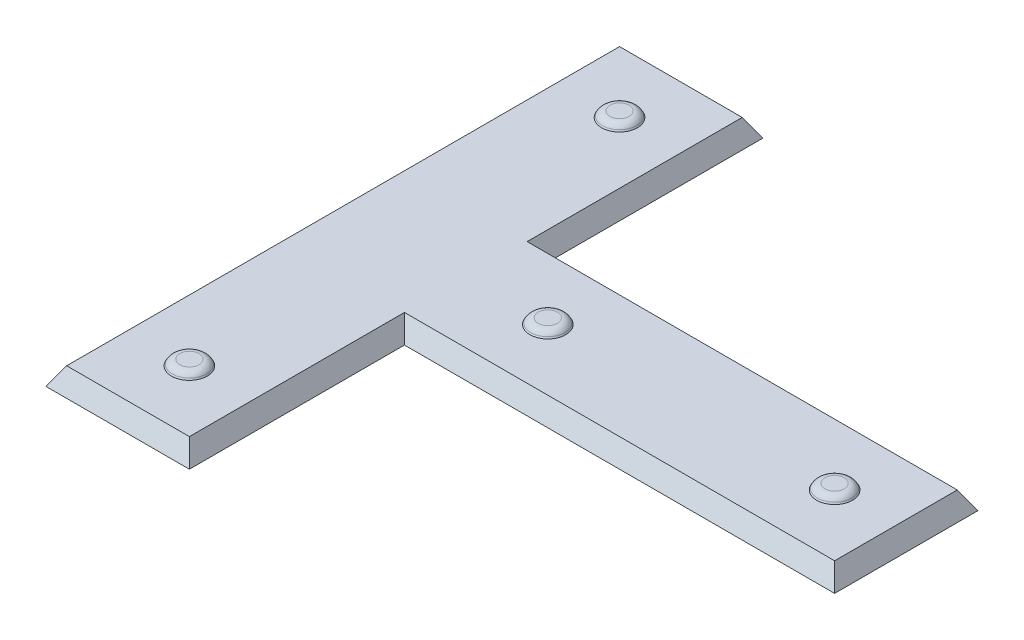
ISO-10303-21;
HEADER;
FILE_DESCRIPTION(('STEP AP214'),'2;1');
FILE_NAME('part.step','',(''),(''),'','','');
FILE_SCHEMA(('AUTOMOTIVE_DESIGN { 1 0 10303 214 1 1 1 1 }'));
ENDSEC;
DATA;
#1=APPLICATION_CONTEXT('core data for automotive mechanical design processes');
#2=APPLICATION_PROTOCOL_DEFINITION('international standard','automotive_design',2000,#1);
#3=PRODUCT_CONTEXT('',#1,'mechanical');
#4=PRODUCT('Part','Part','',(#3));
#5=PRODUCT_RELATED_PRODUCT_CATEGORY('part','',(#4));
#6=PRODUCT_DEFINITION_FORMATION('','',#4);
#7=PRODUCT_DEFINITION_CONTEXT('part definition',#1,'design');
#8=PRODUCT_DEFINITION('design','',#6,#7);
#9=PRODUCT_DEFINITION_SHAPE('','',#8);
#10=(LENGTH_UNIT() NAMED_UNIT(*) SI_UNIT(.MILLI.,.METRE.));
#11=(NAMED_UNIT(*) PLANE_ANGLE_UNIT() SI_UNIT($,.RADIAN.));
#12=(NAMED_UNIT(*) SI_UNIT($,.STERADIAN.) SOLID_ANGLE_UNIT());
#13=UNCERTAINTY_MEASURE_WITH_UNIT(LENGTH_MEASURE(1.E-05),#10,'distance_accuracy_value','');
#14=(GEOMETRIC_REPRESENTATION_CONTEXT(3) GLOBAL_UNCERTAINTY_ASSIGNED_CONTEXT((#13)) GLOBAL_UNIT_ASSIGNED_CONTEXT((#10,
#11,#12)) REPRESENTATION_CONTEXT('',''));
#15=CARTESIAN_POINT('',(0.,0.,0.));
#16=DIRECTION('',(0.,0.,1.));
#17=DIRECTION('',(1.,0.,0.));
#18=AXIS2_PLACEMENT_3D('',#15,#16,#17);
#19=CARTESIAN_POINT('',(-163.5125,15.875,-42.8625));
#20=DIRECTION('',(0.,0.500000000000001,-0.866025403784438));
#21=DIRECTION('',(0.,0.866025403784438,0.500000000000001));
#22=AXIS2_PLACEMENT_3D('',#19,#20,#21);
#23=PLANE('',#22);
#24=DIRECTION('',(-1.,0.,0.));
#25=VECTOR('',#24,1.);
#26=CARTESIAN_POINT('',(-163.5125,15.875,-42.8625));
#27=LINE('',#26,#25);
#28=CARTESIAN_POINT('',(-163.5125,15.875,-42.8625));
#29=VERTEX_POINT('',#28);
#30=CARTESIAN_POINT('',(-169.8625,15.875,-42.8625));
#31=VERTEX_POINT('',#30);
#32=EDGE_CURVE('E105',#29,#31,#27,.T.);
#33=ORIENTED_EDGE('',*,*,#32,.T.);
#34=DIRECTION('',(-0.447213595499959,-0.774596669241483,-0.447213595499959));
#35=VECTOR('',#34,1.);
#36=CARTESIAN_POINT('',(-169.8625,15.875,-42.8625));
#37=LINE('',#36,#35);
#38=CARTESIAN_POINT('',(-169.404228223831,16.66875,-42.4042282238307));
#39=VERTEX_POINT('',#38);
#40=EDGE_CURVE('E113',#39,#31,#37,.T.);
#41=ORIENTED_EDGE('',*,*,#40,.F.);
#42=DIRECTION('',(1.,0.,0.));
#43=VECTOR('',#42,1.);
#44=CARTESIAN_POINT('',(-163.5125,16.66875,-42.4042282238307));
#45=LINE('',#44,#43);
#46=CARTESIAN_POINT('',(-163.970771776169,16.66875,-42.4042282238307));
#47=VERTEX_POINT('',#46);
#48=EDGE_CURVE('E140',#47,#39,#45,.F.);
#49=ORIENTED_EDGE('',*,*,#48,.F.);
#50=DIRECTION('',(0.447213595499959,-0.774596669241482,-0.447213595499959));
#51=VECTOR('',#50,1.);
#52=CARTESIAN_POINT('',(-163.5125,15.875,-42.8625));
#53=LINE('',#52,#51);
#54=EDGE_CURVE('E122',#47,#29,#53,.T.);
#55=ORIENTED_EDGE('',*,*,#54,.T.);
#56=EDGE_LOOP('',(#33,#41,#49,#55));
#57=FACE_BOUND('',#56,.T.);
#58=ADVANCED_FACE('F35',(#57),#23,.T.);
#59=CARTESIAN_POINT('',(-169.8625,15.875,-42.8625));
#60=DIRECTION('',(-0.866025403784438,0.500000000000001,0.));
#61=DIRECTION('',(-0.500000000000001,-0.866025403784438,0.));
#62=AXIS2_PLACEMENT_3D('',#59,#60,#61);
#63=PLANE('',#62);
#64=DIRECTION('',(0.,0.,1.));
#65=VECTOR('',#64,1.);
#66=CARTESIAN_POINT('',(-169.8625,15.875,-42.8625));
#67=LINE('',#66,#65);
#68=CARTESIAN_POINT('',(-169.8625,15.875,-17.4625));
#69=VERTEX_POINT('',#68);
#70=EDGE_CURVE('E100',#31,#69,#67,.T.);
#71=ORIENTED_EDGE('',*,*,#70,.T.);
#72=DIRECTION('',(-0.447213595499959,-0.774596669241483,0.447213595499958));
#73=VECTOR('',#72,1.);
#74=CARTESIAN_POINT('',(-169.8625,15.875,-17.4625));
#75=LINE('',#74,#73);
#76=CARTESIAN_POINT('',(-169.404228223831,16.66875,-17.9207717761693));
#77=VERTEX_POINT('',#76);
#78=EDGE_CURVE('E119',#77,#69,#75,.T.);
#79=ORIENTED_EDGE('',*,*,#78,.F.);
#80=DIRECTION('',(0.,0.,-1.));
#81=VECTOR('',#80,1.);
#82=CARTESIAN_POINT('',(-169.404228223831,16.66875,-42.8625));
#83=LINE('',#82,#81);
#84=EDGE_CURVE('E115',#39,#77,#83,.F.);
#85=ORIENTED_EDGE('',*,*,#84,.F.);
#86=ORIENTED_EDGE('',*,*,#40,.T.);
#87=EDGE_LOOP('',(#71,#79,#85,#86));
#88=FACE_BOUND('',#87,.T.);
#89=ADVANCED_FACE('F114',(#88),#63,.T.);
#90=CARTESIAN_POINT('',(-169.8625,15.875,-17.4625));
#91=DIRECTION('',(0.,0.500000000000001,0.866025403784438));
#92=DIRECTION('',(0.,-0.866025403784438,0.500000000000001));
#93=AXIS2_PLACEMENT_3D('',#90,#91,#92);
#94=PLANE('',#93);
#95=DIRECTION('',(1.,0.,0.));
#96=VECTOR('',#95,1.);
#97=CARTESIAN_POINT('',(-169.8625,15.875,-17.4625));
#98=LINE('',#97,#96);
#99=CARTESIAN_POINT('',(-163.5125,15.875,-17.4625));
#100=VERTEX_POINT('',#99);
#101=EDGE_CURVE('E107',#69,#100,#98,.T.);
#102=ORIENTED_EDGE('',*,*,#101,.T.);
#103=DIRECTION('',(0.447213595499959,-0.774596669241482,0.447213595499959));
#104=VECTOR('',#103,1.);
#105=CARTESIAN_POINT('',(-163.5125,15.875,-17.4625));
#106=LINE('',#105,#104);
#107=CARTESIAN_POINT('',(-163.970771776169,16.66875,-17.9207717761693));
#108=VERTEX_POINT('',#107);
#109=EDGE_CURVE('E155',#108,#100,#106,.T.);
#110=ORIENTED_EDGE('',*,*,#109,.F.);
#111=DIRECTION('',(-1.,0.,0.));
#112=VECTOR('',#111,1.);
#113=CARTESIAN_POINT('',(-169.8625,16.66875,-17.9207717761693));
#114=LINE('',#113,#112);
#115=EDGE_CURVE('E161',#77,#108,#114,.F.);
#116=ORIENTED_EDGE('',*,*,#115,.F.);
#117=ORIENTED_EDGE('',*,*,#78,.T.);
#118=EDGE_LOOP('',(#102,#110,#116,#117));
#119=FACE_BOUND('',#118,.T.);
#120=ADVANCED_FACE('F206',(#119),#94,.T.);
#121=CARTESIAN_POINT('',(-163.5125,15.875,-17.4625));
#122=DIRECTION('',(0.866025403784438,0.500000000000001,0.));
#123=DIRECTION('',(-0.500000000000001,0.866025403784438,0.));
#124=AXIS2_PLACEMENT_3D('',#121,#122,#123);
#125=PLANE('',#124);
#126=DIRECTION('',(0.,0.,-1.));
#127=VECTOR('',#126,1.);
#128=CARTESIAN_POINT('',(-163.5125,15.875,-17.4625));
#129=LINE('',#128,#127);
#130=CARTESIAN_POINT('',(-163.5125,15.875,-26.9875));
#131=VERTEX_POINT('',#130);
#132=EDGE_CURVE('E131',#100,#131,#129,.T.);
#133=ORIENTED_EDGE('',*,*,#132,.T.);
#134=DIRECTION('',(0.447213595499959,-0.774596669241482,0.447213595499959));
#135=VECTOR('',#134,1.);
#136=CARTESIAN_POINT('',(-161.6075,12.5754432115813,-25.0825));
#137=LINE('',#136,#135);
#138=CARTESIAN_POINT('',(-163.970771776169,16.66875,-27.4457717761693));
#139=VERTEX_POINT('',#138);
#140=EDGE_CURVE('E152',#139,#131,#137,.T.);
#141=ORIENTED_EDGE('',*,*,#140,.F.);
#142=DIRECTION('',(0.,0.,1.));
#143=VECTOR('',#142,1.);
#144=CARTESIAN_POINT('',(-163.970771776169,16.66875,-17.4625));
#145=LINE('',#144,#143);
#146=EDGE_CURVE('E163',#108,#139,#145,.F.);
#147=ORIENTED_EDGE('',*,*,#146,.F.);
#148=ORIENTED_EDGE('',*,*,#109,.T.);
#149=EDGE_LOOP('',(#133,#141,#147,#148));
#150=FACE_BOUND('',#149,.T.);
#151=ADVANCED_FACE('F227',(#150),#125,.T.);
#152=CARTESIAN_POINT('',(-163.5125,15.875,-26.9875));
#153=DIRECTION('',(0.,0.500000000000001,0.866025403784438));
#154=DIRECTION('',(0.,-0.866025403784438,0.500000000000001));
#155=AXIS2_PLACEMENT_3D('',#152,#153,#154);
#156=PLANE('',#155);
#157=DIRECTION('',(1.,0.,0.));
#158=VECTOR('',#157,1.);
#159=CARTESIAN_POINT('',(-163.5125,15.875,-26.9875));
#160=LINE('',#159,#158);
#161=CARTESIAN_POINT('',(-144.4625,15.875,-26.9875));
#162=VERTEX_POINT('',#161);
#163=EDGE_CURVE('E133',#131,#162,#160,.T.);
#164=ORIENTED_EDGE('',*,*,#163,.T.);
#165=DIRECTION('',(0.447213595499959,-0.774596669241482,0.447213595499959));
#166=VECTOR('',#165,1.);
#167=CARTESIAN_POINT('',(-144.4625,15.875,-26.9875));
#168=LINE('',#167,#166);
#169=CARTESIAN_POINT('',(-144.920771776169,16.66875,-27.4457717761693));
#170=VERTEX_POINT('',#169);
#171=EDGE_CURVE('E149',#170,#162,#168,.T.);
#172=ORIENTED_EDGE('',*,*,#171,.F.);
#173=DIRECTION('',(-1.,0.,0.));
#174=VECTOR('',#173,1.);
#175=CARTESIAN_POINT('',(-163.5125,16.66875,-27.4457717761693));
#176=LINE('',#175,#174);
#177=EDGE_CURVE('E165',#139,#170,#176,.F.);
#178=ORIENTED_EDGE('',*,*,#177,.F.);
#179=ORIENTED_EDGE('',*,*,#140,.T.);
#180=EDGE_LOOP('',(#164,#172,#178,#179));
#181=FACE_BOUND('',#180,.T.);
#182=ADVANCED_FACE('F223',(#181),#156,.T.);
#183=CARTESIAN_POINT('',(-144.4625,15.875,-26.9875));
#184=DIRECTION('',(0.866025403784438,0.500000000000001,0.));
#185=DIRECTION('',(-0.500000000000001,0.866025403784438,0.));
#186=AXIS2_PLACEMENT_3D('',#183,#184,#185);
#187=PLANE('',#186);
#188=DIRECTION('',(0.,0.,-1.));
#189=VECTOR('',#188,1.);
#190=CARTESIAN_POINT('',(-144.4625,15.875,-26.9875));
#191=LINE('',#190,#189);
#192=CARTESIAN_POINT('',(-144.4625,15.875,-33.3375));
#193=VERTEX_POINT('',#192);
#194=EDGE_CURVE('E135',#162,#193,#191,.T.);
#195=ORIENTED_EDGE('',*,*,#194,.T.);
#196=DIRECTION('',(0.447213595499959,-0.774596669241483,-0.447213595499959));
#197=VECTOR('',#196,1.);
#198=CARTESIAN_POINT('',(-144.4625,15.875,-33.3375));
#199=LINE('',#198,#197);
#200=CARTESIAN_POINT('',(-144.920771776169,16.66875,-32.8792282238307));
#201=VERTEX_POINT('',#200);
#202=EDGE_CURVE('E146',#201,#193,#199,.T.);
#203=ORIENTED_EDGE('',*,*,#202,.F.);
#204=DIRECTION('',(0.,0.,1.));
#205=VECTOR('',#204,1.);
#206=CARTESIAN_POINT('',(-144.920771776169,16.66875,-26.9875));
#207=LINE('',#206,#205);
#208=EDGE_CURVE('E167',#170,#201,#207,.F.);
#209=ORIENTED_EDGE('',*,*,#208,.F.);
#210=ORIENTED_EDGE('',*,*,#171,.T.);
#211=EDGE_LOOP('',(#195,#203,#209,#210));
#212=FACE_BOUND('',#211,.T.);
#213=ADVANCED_FACE('F219',(#212),#187,.T.);
#214=CARTESIAN_POINT('',(-144.4625,15.875,-33.3375));
#215=DIRECTION('',(0.,0.500000000000001,-0.866025403784438));
#216=DIRECTION('',(0.,0.866025403784438,0.500000000000001));
#217=AXIS2_PLACEMENT_3D('',#214,#215,#216);
#218=PLANE('',#217);
#219=DIRECTION('',(-1.,0.,0.));
#220=VECTOR('',#219,1.);
#221=CARTESIAN_POINT('',(-144.4625,15.875,-33.3375));
#222=LINE('',#221,#220);
#223=CARTESIAN_POINT('',(-163.5125,15.875,-33.3375));
#224=VERTEX_POINT('',#223);
#225=EDGE_CURVE('E137',#193,#224,#222,.T.);
#226=ORIENTED_EDGE('',*,*,#225,.T.);
#227=DIRECTION('',(0.447213595499959,-0.774596669241483,-0.447213595499959));
#228=VECTOR('',#227,1.);
#229=CARTESIAN_POINT('',(-159.7025,9.27588642316257,-37.1475));
#230=LINE('',#229,#228);
#231=CARTESIAN_POINT('',(-163.970771776169,16.66875,-32.8792282238307));
#232=VERTEX_POINT('',#231);
#233=EDGE_CURVE('E143',#232,#224,#230,.T.);
#234=ORIENTED_EDGE('',*,*,#233,.F.);
#235=DIRECTION('',(1.,0.,0.));
#236=VECTOR('',#235,1.);
#237=CARTESIAN_POINT('',(-144.4625,16.66875,-32.8792282238307));
#238=LINE('',#237,#236);
#239=EDGE_CURVE('E55',#201,#232,#238,.F.);
#240=ORIENTED_EDGE('',*,*,#239,.F.);
#241=ORIENTED_EDGE('',*,*,#202,.T.);
#242=EDGE_LOOP('',(#226,#234,#240,#241));
#243=FACE_BOUND('',#242,.T.);
#244=ADVANCED_FACE('F215',(#243),#218,.T.);
#245=CARTESIAN_POINT('',(-163.5125,15.875,-33.3375));
#246=DIRECTION('',(0.866025403784438,0.500000000000001,0.));
#247=DIRECTION('',(-0.500000000000001,0.866025403784438,0.));
#248=AXIS2_PLACEMENT_3D('',#245,#246,#247);
#249=PLANE('',#248);
#250=DIRECTION('',(0.,0.,-1.));
#251=VECTOR('',#250,1.);
#252=CARTESIAN_POINT('',(-163.5125,15.875,-33.3375));
#253=LINE('',#252,#251);
#254=EDGE_CURVE('E139',#224,#29,#253,.T.);
#255=ORIENTED_EDGE('',*,*,#254,.T.);
#256=ORIENTED_EDGE('',*,*,#54,.F.);
#257=DIRECTION('',(0.,0.,1.));
#258=VECTOR('',#257,1.);
#259=CARTESIAN_POINT('',(-163.970771776169,16.66875,-33.3375));
#260=LINE('',#259,#258);
#261=EDGE_CURVE('E50',#232,#47,#260,.F.);
#262=ORIENTED_EDGE('',*,*,#261,.F.);
#263=ORIENTED_EDGE('',*,*,#233,.T.);
#264=EDGE_LOOP('',(#255,#256,#262,#263));
#265=FACE_BOUND('',#264,.T.);
#266=ADVANCED_FACE('F211',(#265),#249,.T.);
#267=CARTESIAN_POINT('',(-169.8625,16.66875,-42.8625));
#268=DIRECTION('',(0.,1.,0.));
#269=DIRECTION('',(0.,0.,1.));
#270=AXIS2_PLACEMENT_3D('',#267,#268,#269);
#271=PLANE('',#270);
#272=CARTESIAN_POINT('',(-166.6875,16.66875,-20.6375));
#273=DIRECTION('',(0.,1.,0.));
#274=DIRECTION('',(0.,0.,1.));
#275=AXIS2_PLACEMENT_3D('',#272,#273,#274);
#276=CIRCLE('',#275,0.79375000000002);
#277=CARTESIAN_POINT('',(-166.6875,16.66875,-19.84375));
#278=VERTEX_POINT('',#277);
#279=EDGE_CURVE('E278',#278,#278,#276,.T.);
#280=ORIENTED_EDGE('',*,*,#279,.F.);
#281=EDGE_LOOP('',(#280));
#282=FACE_BOUND('',#281,.T.);
#283=CARTESIAN_POINT('',(-166.6875,16.66875,-39.6875));
#284=DIRECTION('',(0.,1.,0.));
#285=DIRECTION('',(0.,0.,1.));
#286=AXIS2_PLACEMENT_3D('',#283,#284,#285);
#287=CIRCLE('',#286,0.793750000000021);
#288=CARTESIAN_POINT('',(-166.6875,16.66875,-38.89375));
#289=VERTEX_POINT('',#288);
#290=EDGE_CURVE('E282',#289,#289,#287,.T.);
#291=ORIENTED_EDGE('',*,*,#290,.F.);
#292=EDGE_LOOP('',(#291));
#293=FACE_BOUND('',#292,.T.);
#294=CARTESIAN_POINT('',(-160.3375,16.66875,-30.1625));
#295=DIRECTION('',(0.,1.,0.));
#296=DIRECTION('',(0.,0.,1.));
#297=AXIS2_PLACEMENT_3D('',#294,#295,#296);
#298=CIRCLE('',#297,0.79375000000002);
#299=CARTESIAN_POINT('',(-160.3375,16.66875,-29.36875));
#300=VERTEX_POINT('',#299);
#301=EDGE_CURVE('E126',#300,#300,#298,.T.);
#302=ORIENTED_EDGE('',*,*,#301,.F.);
#303=EDGE_LOOP('',(#302));
#304=FACE_BOUND('',#303,.T.);
#305=CARTESIAN_POINT('',(-147.6375,16.66875,-30.1625));
#306=DIRECTION('',(0.,1.,0.));
#307=DIRECTION('',(0.,0.,1.));
#308=AXIS2_PLACEMENT_3D('',#305,#306,#307);
#309=CIRCLE('',#308,0.79375000000002);
#310=CARTESIAN_POINT('',(-147.6375,16.66875,-29.36875));
#311=VERTEX_POINT('',#310);
#312=EDGE_CURVE('E123',#311,#311,#309,.T.);
#313=ORIENTED_EDGE('',*,*,#312,.F.);
#314=EDGE_LOOP('',(#313));
#315=FACE_BOUND('',#314,.T.);
#316=ORIENTED_EDGE('',*,*,#48,.T.);
#317=ORIENTED_EDGE('',*,*,#84,.T.);
#318=ORIENTED_EDGE('',*,*,#115,.T.);
#319=ORIENTED_EDGE('',*,*,#146,.T.);
#320=ORIENTED_EDGE('',*,*,#177,.T.);
#321=ORIENTED_EDGE('',*,*,#208,.T.);
#322=ORIENTED_EDGE('',*,*,#239,.T.);
#323=ORIENTED_EDGE('',*,*,#261,.T.);
#324=EDGE_LOOP('',(#316,#317,#318,#319,#320,#321,#322,#323));
#325=FACE_BOUND('',#324,.T.);
#326=ADVANCED_FACE('F214',(#282,#293,#304,#315,#325),#271,.T.);
#327=CARTESIAN_POINT('',(-169.8625,15.875,-42.8625));
#328=DIRECTION('',(0.,1.,0.));
#329=DIRECTION('',(0.,0.,1.));
#330=AXIS2_PLACEMENT_3D('',#327,#328,#329);
#331=PLANE('',#330);
#332=ORIENTED_EDGE('',*,*,#32,.F.);
#333=ORIENTED_EDGE('',*,*,#254,.F.);
#334=ORIENTED_EDGE('',*,*,#225,.F.);
#335=ORIENTED_EDGE('',*,*,#194,.F.);
#336=ORIENTED_EDGE('',*,*,#163,.F.);
#337=ORIENTED_EDGE('',*,*,#132,.F.);
#338=ORIENTED_EDGE('',*,*,#101,.F.);
#339=ORIENTED_EDGE('',*,*,#70,.F.);
#340=EDGE_LOOP('',(#332,#333,#334,#335,#336,#337,#338,#339));
#341=FACE_BOUND('',#340,.T.);
#342=ADVANCED_FACE('F102',(#341),#331,.F.);
#343=CARTESIAN_POINT('',(-147.6375,16.66875,-30.1625));
#344=DIRECTION('',(0.,-1.,0.));
#345=DIRECTION('',(0.,0.,1.));
#346=AXIS2_PLACEMENT_3D('',#343,#344,#345);
#347=CONICAL_SURFACE('',#346,0.79375000000002,0.5235987755983);
#348=CARTESIAN_POINT('',(-147.6375,16.73225,-30.1625));
#349=DIRECTION('',(0.,-1.,0.));
#350=DIRECTION('',(0.,0.,-1.));
#351=AXIS2_PLACEMENT_3D('',#348,#349,#350);
#352=CIRCLE('',#351,0.757088257906478);
#353=CARTESIAN_POINT('',(-147.6375,16.73225,-30.9195882579065));
#354=VERTEX_POINT('',#353);
#355=EDGE_CURVE('E173',#354,#354,#352,.T.);
#356=ORIENTED_EDGE('',*,*,#355,.T.);
#357=EDGE_LOOP('',(#356));
#358=FACE_BOUND('',#357,.T.);
#359=ORIENTED_EDGE('',*,*,#312,.T.);
#360=EDGE_LOOP('',(#359));
#361=FACE_BOUND('',#360,.T.);
#362=ADVANCED_FACE('F266',(#358,#361),#347,.T.);
#363=CARTESIAN_POINT('',(-147.6375,16.92275,-30.1625));
#364=DIRECTION('',(0.,1.,0.));
#365=DIRECTION('',(0.,0.,1.));
#366=AXIS2_PLACEMENT_3D('',#363,#364,#365);
#367=PLANE('',#366);
#368=CARTESIAN_POINT('',(-147.6375,16.92275,-30.1625));
#369=DIRECTION('',(0.,1.,0.));
#370=DIRECTION('',(0.,0.,1.));
#371=AXIS2_PLACEMENT_3D('',#368,#369,#370);
#372=CIRCLE('',#371,0.427132579064607);
#373=CARTESIAN_POINT('',(-147.6375,16.92275,-29.7353674209354));
#374=VERTEX_POINT('',#373);
#375=EDGE_CURVE('E118',#374,#374,#372,.T.);
#376=ORIENTED_EDGE('',*,*,#375,.T.);
#377=EDGE_LOOP('',(#376));
#378=FACE_BOUND('',#377,.T.);
#379=ADVANCED_FACE('F259',(#378),#367,.T.);
#380=CARTESIAN_POINT('',(-160.3375,16.66875,-30.1625));
#381=DIRECTION('',(0.,-1.,0.));
#382=DIRECTION('',(0.,0.,1.));
#383=AXIS2_PLACEMENT_3D('',#380,#381,#382);
#384=CONICAL_SURFACE('',#383,0.79375000000002,0.5235987755983);
#385=CARTESIAN_POINT('',(-160.3375,16.73225,-30.1625));
#386=DIRECTION('',(0.,-1.,0.));
#387=DIRECTION('',(0.,0.,-1.));
#388=AXIS2_PLACEMENT_3D('',#385,#386,#387);
#389=CIRCLE('',#388,0.757088257906478);
#390=CARTESIAN_POINT('',(-160.3375,16.73225,-30.9195882579065));
#391=VERTEX_POINT('',#390);
#392=EDGE_CURVE('E179',#391,#391,#389,.T.);
#393=ORIENTED_EDGE('',*,*,#392,.T.);
#394=EDGE_LOOP('',(#393));
#395=FACE_BOUND('',#394,.T.);
#396=ORIENTED_EDGE('',*,*,#301,.T.);
#397=EDGE_LOOP('',(#396));
#398=FACE_BOUND('',#397,.T.);
#399=ADVANCED_FACE('F250',(#395,#398),#384,.T.);
#400=CARTESIAN_POINT('',(-160.3375,16.92275,-30.1625));
#401=DIRECTION('',(0.,1.,0.));
#402=DIRECTION('',(0.,0.,1.));
#403=AXIS2_PLACEMENT_3D('',#400,#401,#402);
#404=PLANE('',#403);
#405=CARTESIAN_POINT('',(-160.3375,16.92275,-30.1625));
#406=DIRECTION('',(0.,1.,0.));
#407=DIRECTION('',(0.,0.,1.));
#408=AXIS2_PLACEMENT_3D('',#405,#406,#407);
#409=CIRCLE('',#408,0.427132579064607);
#410=CARTESIAN_POINT('',(-160.3375,16.92275,-29.7353674209354));
#411=VERTEX_POINT('',#410);
#412=EDGE_CURVE('E176',#411,#411,#409,.T.);
#413=ORIENTED_EDGE('',*,*,#412,.T.);
#414=EDGE_LOOP('',(#413));
#415=FACE_BOUND('',#414,.T.);
#416=ADVANCED_FACE('F247',(#415),#404,.T.);
#417=CARTESIAN_POINT('',(-166.6875,16.66875,-39.6875));
#418=DIRECTION('',(0.,-1.,0.));
#419=DIRECTION('',(0.,0.,1.));
#420=AXIS2_PLACEMENT_3D('',#417,#418,#419);
#421=CONICAL_SURFACE('',#420,0.793750000000021,0.5235987755983);
#422=CARTESIAN_POINT('',(-166.6875,16.73225,-39.6875));
#423=DIRECTION('',(0.,-1.,0.));
#424=DIRECTION('',(0.,0.,-1.));
#425=AXIS2_PLACEMENT_3D('',#422,#423,#424);
#426=CIRCLE('',#425,0.757088257906479);
#427=CARTESIAN_POINT('',(-166.6875,16.73225,-40.4445882579065));
#428=VERTEX_POINT('',#427);
#429=EDGE_CURVE('E185',#428,#428,#426,.T.);
#430=ORIENTED_EDGE('',*,*,#429,.T.);
#431=EDGE_LOOP('',(#430));
#432=FACE_BOUND('',#431,.T.);
#433=ORIENTED_EDGE('',*,*,#290,.T.);
#434=EDGE_LOOP('',(#433));
#435=FACE_BOUND('',#434,.T.);
#436=ADVANCED_FACE('F249',(#432,#435),#421,.T.);
#437=CARTESIAN_POINT('',(-166.6875,16.92275,-39.6875));
#438=DIRECTION('',(0.,1.,0.));
#439=DIRECTION('',(0.,0.,1.));
#440=AXIS2_PLACEMENT_3D('',#437,#438,#439);
#441=PLANE('',#440);
#442=CARTESIAN_POINT('',(-166.6875,16.92275,-39.6875));
#443=DIRECTION('',(0.,1.,0.));
#444=DIRECTION('',(0.,0.,1.));
#445=AXIS2_PLACEMENT_3D('',#442,#443,#444);
#446=CIRCLE('',#445,0.427132579064608);
#447=CARTESIAN_POINT('',(-166.6875,16.92275,-39.2603674209354));
#448=VERTEX_POINT('',#447);
#449=EDGE_CURVE('E182',#448,#448,#446,.T.);
#450=ORIENTED_EDGE('',*,*,#449,.T.);
#451=EDGE_LOOP('',(#450));
#452=FACE_BOUND('',#451,.T.);
#453=ADVANCED_FACE('F256',(#452),#441,.T.);
#454=CARTESIAN_POINT('',(-166.6875,16.66875,-20.6375));
#455=DIRECTION('',(0.,-1.,0.));
#456=DIRECTION('',(0.,0.,1.));
#457=AXIS2_PLACEMENT_3D('',#454,#455,#456);
#458=CONICAL_SURFACE('',#457,0.79375000000002,0.5235987755983);
#459=CARTESIAN_POINT('',(-166.6875,16.73225,-20.6375));
#460=DIRECTION('',(0.,-1.,0.));
#461=DIRECTION('',(0.,0.,-1.));
#462=AXIS2_PLACEMENT_3D('',#459,#460,#461);
#463=CIRCLE('',#462,0.757088257906478);
#464=CARTESIAN_POINT('',(-166.6875,16.73225,-21.3945882579065));
#465=VERTEX_POINT('',#464);
#466=EDGE_CURVE('E11',#465,#465,#463,.T.);
#467=ORIENTED_EDGE('',*,*,#466,.T.);
#468=EDGE_LOOP('',(#467));
#469=FACE_BOUND('',#468,.T.);
#470=ORIENTED_EDGE('',*,*,#279,.T.);
#471=EDGE_LOOP('',(#470));
#472=FACE_BOUND('',#471,.T.);
#473=ADVANCED_FACE('F303',(#469,#472),#458,.T.);
#474=CARTESIAN_POINT('',(-166.6875,16.92275,-20.6375));
#475=DIRECTION('',(0.,1.,0.));
#476=DIRECTION('',(0.,0.,1.));
#477=AXIS2_PLACEMENT_3D('',#474,#475,#476);
#478=PLANE('',#477);
#479=CARTESIAN_POINT('',(-166.6875,16.92275,-20.6375));
#480=DIRECTION('',(0.,1.,0.));
#481=DIRECTION('',(0.,0.,1.));
#482=AXIS2_PLACEMENT_3D('',#479,#480,#481);
#483=CIRCLE('',#482,0.427132579064607);
#484=CARTESIAN_POINT('',(-166.6875,16.92275,-20.2103674209354));
#485=VERTEX_POINT('',#484);
#486=EDGE_CURVE('E43',#485,#485,#483,.T.);
#487=ORIENTED_EDGE('',*,*,#486,.T.);
#488=EDGE_LOOP('',(#487));
#489=FACE_BOUND('',#488,.T.);
#490=ADVANCED_FACE('F190',(#489),#478,.T.);
#491=CARTESIAN_POINT('',(-147.6375,16.54175,-30.1625));
#492=DIRECTION('',(0.,1.,0.));
#493=DIRECTION('',(0.,0.,1.));
#494=AXIS2_PLACEMENT_3D('',#491,#492,#493);
#495=TOROIDAL_SURFACE('',#494,0.427132579064607,0.381);
#496=ORIENTED_EDGE('',*,*,#355,.F.);
#497=EDGE_LOOP('',(#496));
#498=FACE_BOUND('',#497,.T.);
#499=ORIENTED_EDGE('',*,*,#375,.F.);
#500=EDGE_LOOP('',(#499));
#501=FACE_BOUND('',#500,.T.);
#502=ADVANCED_FACE('F235',(#498,#501),#495,.T.);
#503=CARTESIAN_POINT('',(-160.3375,16.54175,-30.1625));
#504=DIRECTION('',(0.,1.,0.));
#505=DIRECTION('',(0.,0.,1.));
#506=AXIS2_PLACEMENT_3D('',#503,#504,#505);
#507=TOROIDAL_SURFACE('',#506,0.427132579064607,0.381);
#508=ORIENTED_EDGE('',*,*,#392,.F.);
#509=EDGE_LOOP('',(#508));
#510=FACE_BOUND('',#509,.T.);
#511=ORIENTED_EDGE('',*,*,#412,.F.);
#512=EDGE_LOOP('',(#511));
#513=FACE_BOUND('',#512,.T.);
#514=ADVANCED_FACE('F198',(#510,#513),#507,.T.);
#515=CARTESIAN_POINT('',(-166.6875,16.54175,-39.6875));
#516=DIRECTION('',(0.,1.,0.));
#517=DIRECTION('',(0.,0.,1.));
#518=AXIS2_PLACEMENT_3D('',#515,#516,#517);
#519=TOROIDAL_SURFACE('',#518,0.427132579064608,0.381);
#520=ORIENTED_EDGE('',*,*,#429,.F.);
#521=EDGE_LOOP('',(#520));
#522=FACE_BOUND('',#521,.T.);
#523=ORIENTED_EDGE('',*,*,#449,.F.);
#524=EDGE_LOOP('',(#523));
#525=FACE_BOUND('',#524,.T.);
#526=ADVANCED_FACE('F193',(#522,#525),#519,.T.);
#527=CARTESIAN_POINT('',(-166.6875,16.54175,-20.6375));
#528=DIRECTION('',(0.,1.,0.));
#529=DIRECTION('',(0.,0.,1.));
#530=AXIS2_PLACEMENT_3D('',#527,#528,#529);
#531=TOROIDAL_SURFACE('',#530,0.427132579064607,0.381);
#532=ORIENTED_EDGE('',*,*,#466,.F.);
#533=EDGE_LOOP('',(#532));
#534=FACE_BOUND('',#533,.T.);
#535=ORIENTED_EDGE('',*,*,#486,.F.);
#536=EDGE_LOOP('',(#535));
#537=FACE_BOUND('',#536,.T.);
#538=ADVANCED_FACE('F37',(#534,#537),#531,.T.);
#539=CLOSED_SHELL('',(#58,#89,#120,#151,#182,#213,#244,#266,#326,#342,#362,#379,#399,#416,#436,
#453,#473,#490,#502,#514,#526,#538));
#540=MANIFOLD_SOLID_BREP('B2',#539);
#541=ADVANCED_BREP_SHAPE_REPRESENTATION('',(#18,#540),#14);
#542=SHAPE_DEFINITION_REPRESENTATION(#9,#541);
ENDSEC;
END-ISO-10303-21;
